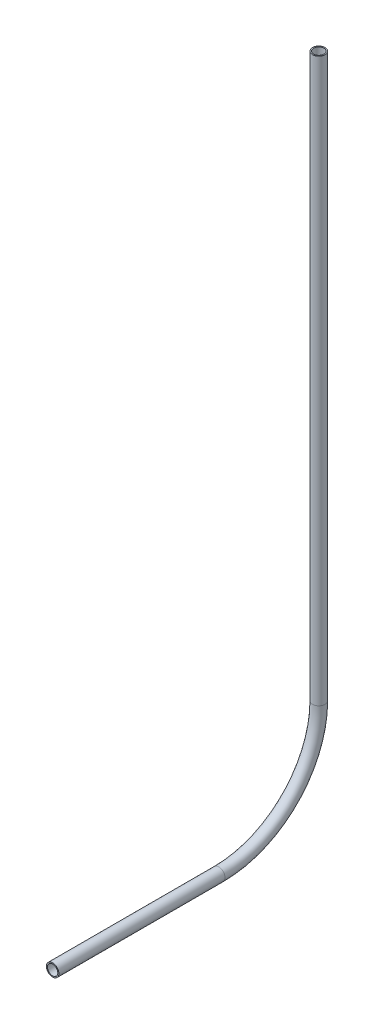
ISO-10303-21;
HEADER;
FILE_DESCRIPTION(('STEP AP214'),'2;1');
FILE_NAME('part.step','',(''),(''),'','','');
FILE_SCHEMA(('AUTOMOTIVE_DESIGN { 1 0 10303 214 1 1 1 1 }'));
ENDSEC;
DATA;
#1=APPLICATION_CONTEXT('core data for automotive mechanical design processes');
#2=APPLICATION_PROTOCOL_DEFINITION('international standard','automotive_design',2000,#1);
#3=PRODUCT_CONTEXT('',#1,'mechanical');
#4=PRODUCT('Part','Part','',(#3));
#5=PRODUCT_RELATED_PRODUCT_CATEGORY('part','',(#4));
#6=PRODUCT_DEFINITION_FORMATION('','',#4);
#7=PRODUCT_DEFINITION_CONTEXT('part definition',#1,'design');
#8=PRODUCT_DEFINITION('design','',#6,#7);
#9=PRODUCT_DEFINITION_SHAPE('','',#8);
#10=(LENGTH_UNIT() NAMED_UNIT(*) SI_UNIT(.MILLI.,.METRE.));
#11=(NAMED_UNIT(*) PLANE_ANGLE_UNIT() SI_UNIT($,.RADIAN.));
#12=(NAMED_UNIT(*) SI_UNIT($,.STERADIAN.) SOLID_ANGLE_UNIT());
#13=UNCERTAINTY_MEASURE_WITH_UNIT(LENGTH_MEASURE(1.E-05),#10,'distance_accuracy_value','');
#14=(GEOMETRIC_REPRESENTATION_CONTEXT(3) GLOBAL_UNCERTAINTY_ASSIGNED_CONTEXT((#13)) GLOBAL_UNIT_ASSIGNED_CONTEXT((#10,
#11,#12)) REPRESENTATION_CONTEXT('',''));
#15=CARTESIAN_POINT('',(0.,0.,0.));
#16=DIRECTION('',(0.,0.,1.));
#17=DIRECTION('',(1.,0.,0.));
#18=AXIS2_PLACEMENT_3D('',#15,#16,#17);
#19=CARTESIAN_POINT('',(0.,164.302951267757,57.9209503694831));
#20=DIRECTION('',(0.,0.,1.));
#21=DIRECTION('',(1.,0.,0.));
#22=AXIS2_PLACEMENT_3D('',#19,#20,#21);
#23=CYLINDRICAL_SURFACE('',#22,2.61619999999999);
#24=CARTESIAN_POINT('',(0.,164.302951267757,142.296320696895));
#25=DIRECTION('',(0.,0.,-1.));
#26=DIRECTION('',(-1.,0.,0.));
#27=AXIS2_PLACEMENT_3D('',#24,#25,#26);
#28=CIRCLE('',#27,2.61619999999999);
#29=CARTESIAN_POINT('',(-2.61619999999999,164.302951267757,142.296320696895));
#30=VERTEX_POINT('',#29);
#31=EDGE_CURVE('E54',#30,#30,#28,.T.);
#32=ORIENTED_EDGE('',*,*,#31,.F.);
#33=EDGE_LOOP('',(#32));
#34=FACE_BOUND('',#33,.T.);
#35=CARTESIAN_POINT('',(0.,164.302951267757,57.9209503694831));
#36=DIRECTION('',(0.,0.,-1.));
#37=DIRECTION('',(-1.,0.,0.));
#38=AXIS2_PLACEMENT_3D('',#35,#36,#37);
#39=CIRCLE('',#38,2.61619999999999);
#40=CARTESIAN_POINT('',(-2.61619999999999,164.302951267757,57.9209503694831));
#41=VERTEX_POINT('',#40);
#42=EDGE_CURVE('E50',#41,#41,#39,.T.);
#43=ORIENTED_EDGE('',*,*,#42,.T.);
#44=EDGE_LOOP('',(#43));
#45=FACE_BOUND('',#44,.T.);
#46=ADVANCED_FACE('F46',(#34,#45),#23,.F.);
#47=CARTESIAN_POINT('',(0.,164.302951267757,57.9209503694831));
#48=DIRECTION('',(0.,0.,1.));
#49=DIRECTION('',(1.,0.,0.));
#50=AXIS2_PLACEMENT_3D('',#47,#48,#49);
#51=CYLINDRICAL_SURFACE('',#50,3.175);
#52=CARTESIAN_POINT('',(0.,164.302951267757,142.296320696895));
#53=DIRECTION('',(0.,0.,-1.));
#54=DIRECTION('',(-1.,0.,0.));
#55=AXIS2_PLACEMENT_3D('',#52,#53,#54);
#56=CIRCLE('',#55,3.175);
#57=CARTESIAN_POINT('',(-3.175,164.302951267757,142.296320696895));
#58=VERTEX_POINT('',#57);
#59=EDGE_CURVE('E58',#58,#58,#56,.T.);
#60=ORIENTED_EDGE('',*,*,#59,.T.);
#61=EDGE_LOOP('',(#60));
#62=FACE_BOUND('',#61,.T.);
#63=CARTESIAN_POINT('',(0.,164.302951267757,57.9209503694831));
#64=DIRECTION('',(0.,0.,-1.));
#65=DIRECTION('',(-1.,0.,0.));
#66=AXIS2_PLACEMENT_3D('',#63,#64,#65);
#67=CIRCLE('',#66,3.175);
#68=CARTESIAN_POINT('',(-3.175,164.302951267757,57.9209503694831));
#69=VERTEX_POINT('',#68);
#70=EDGE_CURVE('E12',#69,#69,#67,.T.);
#71=ORIENTED_EDGE('',*,*,#70,.F.);
#72=EDGE_LOOP('',(#71));
#73=FACE_BOUND('',#72,.T.);
#74=ADVANCED_FACE('F73',(#62,#73),#51,.T.);
#75=CARTESIAN_POINT('',(0.,164.302951267757,142.296320696895));
#76=DIRECTION('',(0.,0.,-1.));
#77=DIRECTION('',(-1.,0.,0.));
#78=AXIS2_PLACEMENT_3D('',#75,#76,#77);
#79=PLANE('',#78);
#80=ORIENTED_EDGE('',*,*,#31,.T.);
#81=EDGE_LOOP('',(#80));
#82=FACE_BOUND('',#81,.T.);
#83=ORIENTED_EDGE('',*,*,#59,.F.);
#84=EDGE_LOOP('',(#83));
#85=FACE_BOUND('',#84,.T.);
#86=ADVANCED_FACE('F69',(#82,#85),#79,.F.);
#87=CARTESIAN_POINT('',(0.,164.302951267757,57.9209503694831));
#88=DIRECTION('',(0.,0.,-1.));
#89=DIRECTION('',(-1.,0.,0.));
#90=AXIS2_PLACEMENT_3D('',#87,#88,#89);
#91=PLANE('',#90);
#92=ORIENTED_EDGE('',*,*,#42,.F.);
#93=EDGE_LOOP('',(#92));
#94=FACE_BOUND('',#93,.T.);
#95=ORIENTED_EDGE('',*,*,#70,.T.);
#96=EDGE_LOOP('',(#95));
#97=FACE_BOUND('',#96,.T.);
#98=ADVANCED_FACE('F48',(#94,#97),#91,.T.);
#99=CLOSED_SHELL('',(#46,#74,#86,#98));
#100=MANIFOLD_SOLID_BREP('B2',#99);
#101=CARTESIAN_POINT('',(0.,215.102951267757,57.9209503694831));
#102=DIRECTION('',(-1.,0.,0.));
#103=DIRECTION('',(0.,0.,1.));
#104=AXIS2_PLACEMENT_3D('',#101,#102,#103);
#105=TOROIDAL_SURFACE('',#104,50.8,2.61619999999999);
#106=CARTESIAN_POINT('',(0.,215.102951267757,7.1209503694831));
#107=DIRECTION('',(0.,1.,0.));
#108=DIRECTION('',(0.,0.,1.));
#109=AXIS2_PLACEMENT_3D('',#106,#107,#108);
#110=CIRCLE('',#109,2.61619999999999);
#111=CARTESIAN_POINT('',(0.,215.102951267757,4.50475036948311));
#112=VERTEX_POINT('',#111);
#113=EDGE_CURVE('E149',#112,#112,#110,.T.);
#114=CARTESIAN_POINT('',(0.,164.302951267757,57.9209503694831));
#115=DIRECTION('',(0.,0.,1.));
#116=DIRECTION('',(1.,0.,0.));
#117=AXIS2_PLACEMENT_3D('',#114,#115,#116);
#118=CIRCLE('',#117,2.61619999999999);
#119=CARTESIAN_POINT('',(0.,161.686751267757,57.9209503694831));
#120=VERTEX_POINT('',#119);
#121=EDGE_CURVE('E139',#120,#120,#118,.T.);
#122=CARTESIAN_POINT('',(0.,215.102951267757,57.9209503694831));
#123=DIRECTION('',(-1.,0.,0.));
#124=DIRECTION('',(0.,0.,1.));
#125=AXIS2_PLACEMENT_3D('',#122,#123,#124);
#126=CIRCLE('',#125,53.4162);
#127=EDGE_CURVE('',#112,#120,#126,.T.);
#128=ORIENTED_EDGE('',*,*,#113,.T.);
#129=ORIENTED_EDGE('',*,*,#121,.T.);
#130=ORIENTED_EDGE('',*,*,#127,.T.);
#131=ORIENTED_EDGE('',*,*,#127,.F.);
#132=EDGE_LOOP('',(#128,#130,#129,#131));
#133=FACE_BOUND('',#132,.T.);
#134=ADVANCED_FACE('F135',(#133),#105,.F.);
#135=CARTESIAN_POINT('',(0.,215.102951267757,57.9209503694831));
#136=DIRECTION('',(-1.,0.,0.));
#137=DIRECTION('',(0.,0.,1.));
#138=AXIS2_PLACEMENT_3D('',#135,#136,#137);
#139=TOROIDAL_SURFACE('',#138,50.8,3.175);
#140=CARTESIAN_POINT('',(0.,215.102951267757,7.1209503694831));
#141=DIRECTION('',(0.,1.,0.));
#142=DIRECTION('',(0.,0.,1.));
#143=AXIS2_PLACEMENT_3D('',#140,#141,#142);
#144=CIRCLE('',#143,3.175);
#145=CARTESIAN_POINT('',(0.,215.102951267757,3.9459503694831));
#146=VERTEX_POINT('',#145);
#147=EDGE_CURVE('E143',#146,#146,#144,.T.);
#148=CARTESIAN_POINT('',(0.,164.302951267757,57.9209503694831));
#149=DIRECTION('',(0.,0.,1.));
#150=DIRECTION('',(1.,0.,0.));
#151=AXIS2_PLACEMENT_3D('',#148,#149,#150);
#152=CIRCLE('',#151,3.175);
#153=CARTESIAN_POINT('',(0.,161.127951267757,57.9209503694831));
#154=VERTEX_POINT('',#153);
#155=EDGE_CURVE('E45',#154,#154,#152,.T.);
#156=CARTESIAN_POINT('',(0.,215.102951267757,57.9209503694831));
#157=DIRECTION('',(-1.,0.,0.));
#158=DIRECTION('',(0.,0.,1.));
#159=AXIS2_PLACEMENT_3D('',#156,#157,#158);
#160=CIRCLE('',#159,53.975);
#161=EDGE_CURVE('',#146,#154,#160,.T.);
#162=ORIENTED_EDGE('',*,*,#147,.F.);
#163=ORIENTED_EDGE('',*,*,#155,.F.);
#164=ORIENTED_EDGE('',*,*,#161,.T.);
#165=ORIENTED_EDGE('',*,*,#161,.F.);
#166=EDGE_LOOP('',(#162,#164,#163,#165));
#167=FACE_BOUND('',#166,.T.);
#168=ADVANCED_FACE('F162',(#167),#139,.T.);
#169=CARTESIAN_POINT('',(0.,215.102951267757,7.12095036948312));
#170=DIRECTION('',(0.,1.,0.));
#171=DIRECTION('',(0.,0.,1.));
#172=AXIS2_PLACEMENT_3D('',#169,#170,#171);
#173=PLANE('',#172);
#174=ORIENTED_EDGE('',*,*,#113,.F.);
#175=EDGE_LOOP('',(#174));
#176=FACE_BOUND('',#175,.T.);
#177=ORIENTED_EDGE('',*,*,#147,.T.);
#178=EDGE_LOOP('',(#177));
#179=FACE_BOUND('',#178,.T.);
#180=ADVANCED_FACE('F158',(#176,#179),#173,.T.);
#181=CARTESIAN_POINT('',(0.,164.302951267757,57.9209503694831));
#182=DIRECTION('',(0.,0.,1.));
#183=DIRECTION('',(1.,0.,0.));
#184=AXIS2_PLACEMENT_3D('',#181,#182,#183);
#185=PLANE('',#184);
#186=ORIENTED_EDGE('',*,*,#121,.F.);
#187=EDGE_LOOP('',(#186));
#188=FACE_BOUND('',#187,.T.);
#189=ORIENTED_EDGE('',*,*,#155,.T.);
#190=EDGE_LOOP('',(#189));
#191=FACE_BOUND('',#190,.T.);
#192=ADVANCED_FACE('F137',(#188,#191),#185,.T.);
#193=CLOSED_SHELL('',(#134,#168,#180,#192));
#194=MANIFOLD_SOLID_BREP('B7',#193);
#195=CARTESIAN_POINT('',(0.,500.823219170173,7.12095036948313));
#196=DIRECTION('',(0.,-1.,0.));
#197=DIRECTION('',(0.,0.,-1.));
#198=AXIS2_PLACEMENT_3D('',#195,#196,#197);
#199=CYLINDRICAL_SURFACE('',#198,2.61619999999999);
#200=CARTESIAN_POINT('',(0.,500.823219170173,7.12095036948313));
#201=DIRECTION('',(0.,1.,0.));
#202=DIRECTION('',(-1.,0.,0.));
#203=AXIS2_PLACEMENT_3D('',#200,#201,#202);
#204=CIRCLE('',#203,2.61619999999999);
#205=CARTESIAN_POINT('',(-2.61619999999999,500.823219170173,7.12095036948313));
#206=VERTEX_POINT('',#205);
#207=EDGE_CURVE('E233',#206,#206,#204,.T.);
#208=ORIENTED_EDGE('',*,*,#207,.T.);
#209=EDGE_LOOP('',(#208));
#210=FACE_BOUND('',#209,.T.);
#211=CARTESIAN_POINT('',(0.,215.102951267757,7.12095036948313));
#212=DIRECTION('',(0.,-1.,0.));
#213=DIRECTION('',(0.,0.,-1.));
#214=AXIS2_PLACEMENT_3D('',#211,#212,#213);
#215=CIRCLE('',#214,2.61619999999999);
#216=CARTESIAN_POINT('',(0.,215.102951267757,4.50475036948314));
#217=VERTEX_POINT('',#216);
#218=EDGE_CURVE('E223',#217,#217,#215,.T.);
#219=ORIENTED_EDGE('',*,*,#218,.T.);
#220=EDGE_LOOP('',(#219));
#221=FACE_BOUND('',#220,.T.);
#222=ADVANCED_FACE('F219',(#210,#221),#199,.F.);
#223=CARTESIAN_POINT('',(0.,500.823219170173,7.12095036948313));
#224=DIRECTION('',(0.,-1.,0.));
#225=DIRECTION('',(0.,0.,-1.));
#226=AXIS2_PLACEMENT_3D('',#223,#224,#225);
#227=CYLINDRICAL_SURFACE('',#226,3.175);
#228=CARTESIAN_POINT('',(0.,500.823219170173,7.12095036948313));
#229=DIRECTION('',(0.,1.,0.));
#230=DIRECTION('',(-1.,0.,0.));
#231=AXIS2_PLACEMENT_3D('',#228,#229,#230);
#232=CIRCLE('',#231,3.175);
#233=CARTESIAN_POINT('',(-3.175,500.823219170173,7.12095036948313));
#234=VERTEX_POINT('',#233);
#235=EDGE_CURVE('E227',#234,#234,#232,.T.);
#236=ORIENTED_EDGE('',*,*,#235,.F.);
#237=EDGE_LOOP('',(#236));
#238=FACE_BOUND('',#237,.T.);
#239=CARTESIAN_POINT('',(0.,215.102951267757,7.12095036948313));
#240=DIRECTION('',(0.,-1.,0.));
#241=DIRECTION('',(0.,0.,-1.));
#242=AXIS2_PLACEMENT_3D('',#239,#240,#241);
#243=CIRCLE('',#242,3.175);
#244=CARTESIAN_POINT('',(0.,215.102951267757,3.94595036948313));
#245=VERTEX_POINT('',#244);
#246=EDGE_CURVE('E134',#245,#245,#243,.T.);
#247=ORIENTED_EDGE('',*,*,#246,.F.);
#248=EDGE_LOOP('',(#247));
#249=FACE_BOUND('',#248,.T.);
#250=ADVANCED_FACE('F246',(#238,#249),#227,.T.);
#251=CARTESIAN_POINT('',(0.,500.823219170173,7.12095036948313));
#252=DIRECTION('',(0.,1.,0.));
#253=DIRECTION('',(-1.,0.,0.));
#254=AXIS2_PLACEMENT_3D('',#251,#252,#253);
#255=PLANE('',#254);
#256=ORIENTED_EDGE('',*,*,#207,.F.);
#257=EDGE_LOOP('',(#256));
#258=FACE_BOUND('',#257,.T.);
#259=ORIENTED_EDGE('',*,*,#235,.T.);
#260=EDGE_LOOP('',(#259));
#261=FACE_BOUND('',#260,.T.);
#262=ADVANCED_FACE('F242',(#258,#261),#255,.T.);
#263=CARTESIAN_POINT('',(0.,215.102951267757,7.12095036948312));
#264=DIRECTION('',(0.,-1.,0.));
#265=DIRECTION('',(0.,0.,-1.));
#266=AXIS2_PLACEMENT_3D('',#263,#264,#265);
#267=PLANE('',#266);
#268=ORIENTED_EDGE('',*,*,#218,.F.);
#269=EDGE_LOOP('',(#268));
#270=FACE_BOUND('',#269,.T.);
#271=ORIENTED_EDGE('',*,*,#246,.T.);
#272=EDGE_LOOP('',(#271));
#273=FACE_BOUND('',#272,.T.);
#274=ADVANCED_FACE('F221',(#270,#273),#267,.T.);
#275=CLOSED_SHELL('',(#222,#250,#262,#274));
#276=MANIFOLD_SOLID_BREP('B40',#275);
#277=ADVANCED_BREP_SHAPE_REPRESENTATION('',(#18,#100,#194,#276),#14);
#278=SHAPE_DEFINITION_REPRESENTATION(#9,#277);
ENDSEC;
END-ISO-10303-21;
